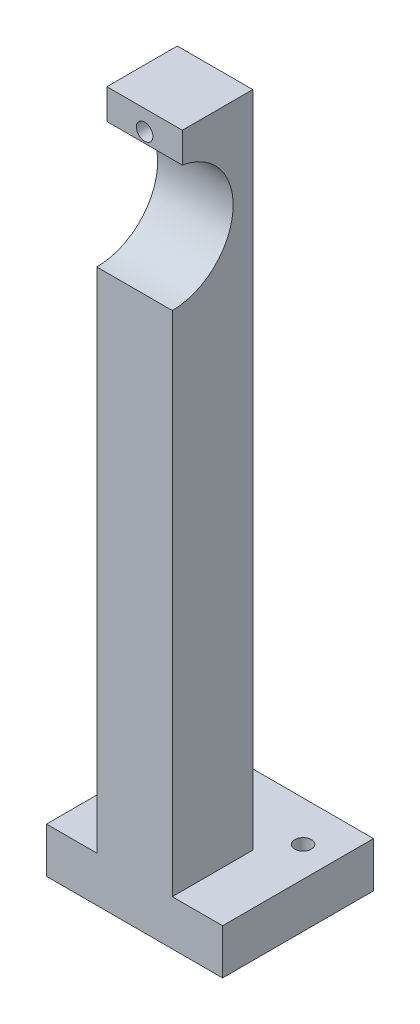
ISO-10303-21;
HEADER;
FILE_DESCRIPTION(('STEP AP214'),'2;1');
FILE_NAME('part.step','',(''),(''),'','','');
FILE_SCHEMA(('AUTOMOTIVE_DESIGN { 1 0 10303 214 1 1 1 1 }'));
ENDSEC;
DATA;
#1=APPLICATION_CONTEXT('core data for automotive mechanical design processes');
#2=APPLICATION_PROTOCOL_DEFINITION('international standard','automotive_design',2000,#1);
#3=PRODUCT_CONTEXT('',#1,'mechanical');
#4=PRODUCT('Part','Part','',(#3));
#5=PRODUCT_RELATED_PRODUCT_CATEGORY('part','',(#4));
#6=PRODUCT_DEFINITION_FORMATION('','',#4);
#7=PRODUCT_DEFINITION_CONTEXT('part definition',#1,'design');
#8=PRODUCT_DEFINITION('design','',#6,#7);
#9=PRODUCT_DEFINITION_SHAPE('','',#8);
#10=(LENGTH_UNIT() NAMED_UNIT(*) SI_UNIT(.MILLI.,.METRE.));
#11=(NAMED_UNIT(*) PLANE_ANGLE_UNIT() SI_UNIT($,.RADIAN.));
#12=(NAMED_UNIT(*) SI_UNIT($,.STERADIAN.) SOLID_ANGLE_UNIT());
#13=UNCERTAINTY_MEASURE_WITH_UNIT(LENGTH_MEASURE(1.E-05),#10,'distance_accuracy_value','');
#14=(GEOMETRIC_REPRESENTATION_CONTEXT(3) GLOBAL_UNCERTAINTY_ASSIGNED_CONTEXT((#13)) GLOBAL_UNIT_ASSIGNED_CONTEXT((#10,
#11,#12)) REPRESENTATION_CONTEXT('',''));
#15=CARTESIAN_POINT('',(0.,0.,0.));
#16=DIRECTION('',(0.,0.,1.));
#17=DIRECTION('',(1.,0.,0.));
#18=AXIS2_PLACEMENT_3D('',#15,#16,#17);
#19=CARTESIAN_POINT('',(137.307957149337,0.,0.));
#20=DIRECTION('',(1.,0.,0.));
#21=DIRECTION('',(0.,0.,-1.));
#22=AXIS2_PLACEMENT_3D('',#19,#20,#21);
#23=PLANE('',#22);
#24=DIRECTION('',(0.,0.,-1.));
#25=VECTOR('',#24,1.);
#26=CARTESIAN_POINT('',(137.307957149337,14.,0.));
#27=LINE('',#26,#25);
#28=CARTESIAN_POINT('',(137.307957149337,14.,-21.990466694079));
#29=VERTEX_POINT('',#28);
#30=CARTESIAN_POINT('',(137.307957149337,14.,-37.990466694079));
#31=VERTEX_POINT('',#30);
#32=EDGE_CURVE('E12',#29,#31,#27,.T.);
#33=ORIENTED_EDGE('',*,*,#32,.F.);
#34=DIRECTION('',(0.,-1.,0.));
#35=VECTOR('',#34,1.);
#36=CARTESIAN_POINT('',(137.307957149337,144.933566105737,-21.9904666940789));
#37=LINE('',#36,#35);
#38=CARTESIAN_POINT('',(137.307957149337,114.9,-21.990466694079));
#39=VERTEX_POINT('',#38);
#40=EDGE_CURVE('E259',#39,#29,#37,.T.);
#41=ORIENTED_EDGE('',*,*,#40,.F.);
#42=CARTESIAN_POINT('',(137.307957149337,127.,-21.9904666940789));
#43=DIRECTION('',(1.,0.,0.));
#44=DIRECTION('',(0.,0.,-1.));
#45=AXIS2_PLACEMENT_3D('',#42,#43,#44);
#46=CIRCLE('',#45,12.1);
#47=CARTESIAN_POINT('',(137.307957149337,138.933566105737,-23.990466694079));
#48=VERTEX_POINT('',#47);
#49=EDGE_CURVE('E82',#39,#48,#46,.T.);
#50=ORIENTED_EDGE('',*,*,#49,.T.);
#51=DIRECTION('',(0.,1.,0.));
#52=VECTOR('',#51,1.);
#53=CARTESIAN_POINT('',(137.307957149337,0.,-23.990466694079));
#54=LINE('',#53,#52);
#55=CARTESIAN_POINT('',(137.307957149337,144.933566105737,-23.990466694079));
#56=VERTEX_POINT('',#55);
#57=EDGE_CURVE('E192',#48,#56,#54,.T.);
#58=ORIENTED_EDGE('',*,*,#57,.T.);
#59=DIRECTION('',(0.,0.,-1.));
#60=VECTOR('',#59,1.);
#61=CARTESIAN_POINT('',(137.307957149337,144.933566105737,0.));
#62=LINE('',#61,#60);
#63=CARTESIAN_POINT('',(137.307957149337,144.933566105737,-37.990466694079));
#64=VERTEX_POINT('',#63);
#65=EDGE_CURVE('E189',#56,#64,#62,.T.);
#66=ORIENTED_EDGE('',*,*,#65,.T.);
#67=DIRECTION('',(0.,-1.,0.));
#68=VECTOR('',#67,1.);
#69=CARTESIAN_POINT('',(137.307957149337,0.,-37.990466694079));
#70=LINE('',#69,#68);
#71=EDGE_CURVE('E186',#64,#31,#70,.T.);
#72=ORIENTED_EDGE('',*,*,#71,.T.);
#73=EDGE_LOOP('',(#33,#41,#50,#58,#66,#72));
#74=FACE_BOUND('',#73,.T.);
#75=ADVANCED_FACE('F56',(#74),#23,.F.);
#76=CARTESIAN_POINT('',(152.307957149337,0.,0.));
#77=DIRECTION('',(1.,0.,0.));
#78=DIRECTION('',(0.,0.,-1.));
#79=AXIS2_PLACEMENT_3D('',#76,#77,#78);
#80=PLANE('',#79);
#81=DIRECTION('',(0.,1.,0.));
#82=VECTOR('',#81,1.);
#83=CARTESIAN_POINT('',(152.307957149337,13.9999999999999,-21.990466694079));
#84=LINE('',#83,#82);
#85=CARTESIAN_POINT('',(152.307957149337,14.,-21.990466694079));
#86=VERTEX_POINT('',#85);
#87=CARTESIAN_POINT('',(152.307957149337,114.9,-21.990466694079));
#88=VERTEX_POINT('',#87);
#89=EDGE_CURVE('E237',#86,#88,#84,.T.);
#90=ORIENTED_EDGE('',*,*,#89,.F.);
#91=DIRECTION('',(0.,0.,-1.));
#92=VECTOR('',#91,1.);
#93=CARTESIAN_POINT('',(152.307957149337,14.,0.));
#94=LINE('',#93,#92);
#95=CARTESIAN_POINT('',(152.307957149337,14.,-37.990466694079));
#96=VERTEX_POINT('',#95);
#97=EDGE_CURVE('E66',#86,#96,#94,.T.);
#98=ORIENTED_EDGE('',*,*,#97,.T.);
#99=DIRECTION('',(0.,-1.,0.));
#100=VECTOR('',#99,1.);
#101=CARTESIAN_POINT('',(152.307957149337,0.,-37.990466694079));
#102=LINE('',#101,#100);
#103=CARTESIAN_POINT('',(152.307957149337,144.933566105737,-37.990466694079));
#104=VERTEX_POINT('',#103);
#105=EDGE_CURVE('E185',#104,#96,#102,.T.);
#106=ORIENTED_EDGE('',*,*,#105,.F.);
#107=DIRECTION('',(0.,0.,-1.));
#108=VECTOR('',#107,1.);
#109=CARTESIAN_POINT('',(152.307957149337,144.933566105737,0.));
#110=LINE('',#109,#108);
#111=CARTESIAN_POINT('',(152.307957149337,144.933566105737,-23.990466694079));
#112=VERTEX_POINT('',#111);
#113=EDGE_CURVE('E201',#112,#104,#110,.T.);
#114=ORIENTED_EDGE('',*,*,#113,.F.);
#115=DIRECTION('',(0.,1.,0.));
#116=VECTOR('',#115,1.);
#117=CARTESIAN_POINT('',(152.307957149337,0.,-23.990466694079));
#118=LINE('',#117,#116);
#119=CARTESIAN_POINT('',(152.307957149337,138.933566105737,-23.990466694079));
#120=VERTEX_POINT('',#119);
#121=EDGE_CURVE('E204',#120,#112,#118,.T.);
#122=ORIENTED_EDGE('',*,*,#121,.F.);
#123=CARTESIAN_POINT('',(152.307957149337,127.,-21.9904666940789));
#124=DIRECTION('',(1.,0.,0.));
#125=DIRECTION('',(0.,0.,-1.));
#126=AXIS2_PLACEMENT_3D('',#123,#124,#125);
#127=CIRCLE('',#126,12.1);
#128=EDGE_CURVE('E100',#88,#120,#127,.T.);
#129=ORIENTED_EDGE('',*,*,#128,.F.);
#130=EDGE_LOOP('',(#90,#98,#106,#114,#122,#129));
#131=FACE_BOUND('',#130,.T.);
#132=ADVANCED_FACE('F235',(#131),#80,.T.);
#133=CARTESIAN_POINT('',(137.307957149337,127.,-21.9904666940789));
#134=DIRECTION('',(1.,0.,0.));
#135=DIRECTION('',(0.,0.,-1.));
#136=AXIS2_PLACEMENT_3D('',#133,#134,#135);
#137=CYLINDRICAL_SURFACE('',#136,12.1);
#138=ORIENTED_EDGE('',*,*,#49,.F.);
#139=DIRECTION('',(1.,0.,0.));
#140=VECTOR('',#139,1.);
#141=CARTESIAN_POINT('',(137.307957149337,114.9,-21.990466694079));
#142=LINE('',#141,#140);
#143=EDGE_CURVE('E162',#39,#88,#142,.T.);
#144=ORIENTED_EDGE('',*,*,#143,.T.);
#145=ORIENTED_EDGE('',*,*,#128,.T.);
#146=DIRECTION('',(1.,0.,0.));
#147=VECTOR('',#146,1.);
#148=CARTESIAN_POINT('',(137.307957149337,138.933566105737,-23.990466694079));
#149=LINE('',#148,#147);
#150=EDGE_CURVE('E209',#48,#120,#149,.T.);
#151=ORIENTED_EDGE('',*,*,#150,.F.);
#152=EDGE_LOOP('',(#138,#144,#145,#151));
#153=FACE_BOUND('',#152,.T.);
#154=ADVANCED_FACE('F251',(#153),#137,.F.);
#155=CARTESIAN_POINT('',(137.307957149337,0.,-23.990466694079));
#156=DIRECTION('',(0.,0.,-1.));
#157=DIRECTION('',(0.,1.,0.));
#158=AXIS2_PLACEMENT_3D('',#155,#156,#157);
#159=PLANE('',#158);
#160=CARTESIAN_POINT('',(144.807957149337,140.933566105737,-23.990466694079));
#161=DIRECTION('',(0.,0.,-1.));
#162=DIRECTION('',(0.,1.,0.));
#163=AXIS2_PLACEMENT_3D('',#160,#161,#162);
#164=CIRCLE('',#163,1.64999999999998);
#165=CARTESIAN_POINT('',(144.807957149337,142.583566105737,-23.990466694079));
#166=VERTEX_POINT('',#165);
#167=EDGE_CURVE('E180',#166,#166,#164,.T.);
#168=ORIENTED_EDGE('',*,*,#167,.T.);
#169=EDGE_LOOP('',(#168));
#170=FACE_BOUND('',#169,.T.);
#171=ORIENTED_EDGE('',*,*,#121,.T.);
#172=DIRECTION('',(1.,0.,0.));
#173=VECTOR('',#172,1.);
#174=CARTESIAN_POINT('',(137.307957149337,144.933566105737,-23.990466694079));
#175=LINE('',#174,#173);
#176=EDGE_CURVE('E212',#56,#112,#175,.T.);
#177=ORIENTED_EDGE('',*,*,#176,.F.);
#178=ORIENTED_EDGE('',*,*,#57,.F.);
#179=ORIENTED_EDGE('',*,*,#150,.T.);
#180=EDGE_LOOP('',(#171,#177,#178,#179));
#181=FACE_BOUND('',#180,.T.);
#182=ADVANCED_FACE('F249',(#170,#181),#159,.F.);
#183=CARTESIAN_POINT('',(137.307957149337,144.933566105737,0.));
#184=DIRECTION('',(0.,-1.,0.));
#185=DIRECTION('',(0.,0.,-1.));
#186=AXIS2_PLACEMENT_3D('',#183,#184,#185);
#187=PLANE('',#186);
#188=ORIENTED_EDGE('',*,*,#113,.T.);
#189=DIRECTION('',(1.,0.,0.));
#190=VECTOR('',#189,1.);
#191=CARTESIAN_POINT('',(137.307957149337,144.933566105737,-37.990466694079));
#192=LINE('',#191,#190);
#193=EDGE_CURVE('E216',#64,#104,#192,.T.);
#194=ORIENTED_EDGE('',*,*,#193,.F.);
#195=ORIENTED_EDGE('',*,*,#65,.F.);
#196=ORIENTED_EDGE('',*,*,#176,.T.);
#197=EDGE_LOOP('',(#188,#194,#195,#196));
#198=FACE_BOUND('',#197,.T.);
#199=ADVANCED_FACE('F245',(#198),#187,.F.);
#200=CARTESIAN_POINT('',(137.307957149337,0.,-37.990466694079));
#201=DIRECTION('',(0.,0.,1.));
#202=DIRECTION('',(0.,-1.,0.));
#203=AXIS2_PLACEMENT_3D('',#200,#201,#202);
#204=PLANE('',#203);
#205=CARTESIAN_POINT('',(144.807957149337,140.933566105737,-37.990466694079));
#206=DIRECTION('',(0.,0.,1.));
#207=DIRECTION('',(0.,-1.,0.));
#208=AXIS2_PLACEMENT_3D('',#205,#206,#207);
#209=CIRCLE('',#208,1.64999999999998);
#210=CARTESIAN_POINT('',(144.807957149337,139.283566105737,-37.990466694079));
#211=VERTEX_POINT('',#210);
#212=EDGE_CURVE('E181',#211,#211,#209,.T.);
#213=ORIENTED_EDGE('',*,*,#212,.T.);
#214=EDGE_LOOP('',(#213));
#215=FACE_BOUND('',#214,.T.);
#216=ORIENTED_EDGE('',*,*,#105,.T.);
#217=DIRECTION('',(1.,0.,0.));
#218=VECTOR('',#217,1.);
#219=CARTESIAN_POINT('',(137.307957149337,14.,-37.990466694079));
#220=LINE('',#219,#218);
#221=EDGE_CURVE('E220',#31,#96,#220,.T.);
#222=ORIENTED_EDGE('',*,*,#221,.F.);
#223=ORIENTED_EDGE('',*,*,#71,.F.);
#224=ORIENTED_EDGE('',*,*,#193,.T.);
#225=EDGE_LOOP('',(#216,#222,#223,#224));
#226=FACE_BOUND('',#225,.T.);
#227=ADVANCED_FACE('F240',(#215,#226),#204,.F.);
#228=CARTESIAN_POINT('',(137.307957149337,14.,0.));
#229=DIRECTION('',(0.,1.,0.));
#230=DIRECTION('',(0.,0.,1.));
#231=AXIS2_PLACEMENT_3D('',#228,#229,#230);
#232=PLANE('',#231);
#233=DIRECTION('',(-1.,0.,0.));
#234=VECTOR('',#233,1.);
#235=CARTESIAN_POINT('',(162.307957149337,14.,-21.990466694079));
#236=LINE('',#235,#234);
#237=CARTESIAN_POINT('',(162.307957149337,14.,-21.990466694079));
#238=VERTEX_POINT('',#237);
#239=EDGE_CURVE('E146',#238,#86,#236,.T.);
#240=ORIENTED_EDGE('',*,*,#239,.F.);
#241=DIRECTION('',(0.,0.,1.));
#242=VECTOR('',#241,1.);
#243=CARTESIAN_POINT('',(162.307957149337,14.,-5.99046669407898));
#244=LINE('',#243,#242);
#245=CARTESIAN_POINT('',(162.307957149337,14.,-51.990466694079));
#246=VERTEX_POINT('',#245);
#247=EDGE_CURVE('E159',#246,#238,#244,.T.);
#248=ORIENTED_EDGE('',*,*,#247,.F.);
#249=DIRECTION('',(1.,0.,0.));
#250=VECTOR('',#249,1.);
#251=CARTESIAN_POINT('',(137.307957149337,14.,-51.990466694079));
#252=LINE('',#251,#250);
#253=CARTESIAN_POINT('',(127.307957149337,14.,-51.990466694079));
#254=VERTEX_POINT('',#253);
#255=EDGE_CURVE('E223',#254,#246,#252,.T.);
#256=ORIENTED_EDGE('',*,*,#255,.F.);
#257=DIRECTION('',(0.,0.,-1.));
#258=VECTOR('',#257,1.);
#259=CARTESIAN_POINT('',(127.307957149337,14.,8.00953330592103));
#260=LINE('',#259,#258);
#261=CARTESIAN_POINT('',(127.307957149337,14.,-21.990466694079));
#262=VERTEX_POINT('',#261);
#263=EDGE_CURVE('E169',#262,#254,#260,.T.);
#264=ORIENTED_EDGE('',*,*,#263,.F.);
#265=DIRECTION('',(-1.,0.,0.));
#266=VECTOR('',#265,1.);
#267=CARTESIAN_POINT('',(137.307957149337,14.,-21.990466694079));
#268=LINE('',#267,#266);
#269=EDGE_CURVE('E286',#29,#262,#268,.T.);
#270=ORIENTED_EDGE('',*,*,#269,.F.);
#271=ORIENTED_EDGE('',*,*,#32,.T.);
#272=ORIENTED_EDGE('',*,*,#221,.T.);
#273=ORIENTED_EDGE('',*,*,#97,.F.);
#274=EDGE_LOOP('',(#240,#248,#256,#264,#270,#271,#272,#273));
#275=FACE_BOUND('',#274,.T.);
#276=CARTESIAN_POINT('',(133.307957149337,14.,-43.990466694079));
#277=DIRECTION('',(0.,1.,0.));
#278=DIRECTION('',(0.,0.,1.));
#279=AXIS2_PLACEMENT_3D('',#276,#277,#278);
#280=CIRCLE('',#279,1.64999999999998);
#281=CARTESIAN_POINT('',(133.307957149337,14.,-42.340466694079));
#282=VERTEX_POINT('',#281);
#283=EDGE_CURVE('E264',#282,#282,#280,.T.);
#284=ORIENTED_EDGE('',*,*,#283,.F.);
#285=EDGE_LOOP('',(#284));
#286=FACE_BOUND('',#285,.T.);
#287=CARTESIAN_POINT('',(156.307957149337,14.,-43.990466694079));
#288=DIRECTION('',(0.,1.,0.));
#289=DIRECTION('',(0.,0.,1.));
#290=AXIS2_PLACEMENT_3D('',#287,#288,#289);
#291=CIRCLE('',#290,1.64999999999998);
#292=CARTESIAN_POINT('',(156.307957149337,14.,-42.340466694079));
#293=VERTEX_POINT('',#292);
#294=EDGE_CURVE('E268',#293,#293,#291,.T.);
#295=ORIENTED_EDGE('',*,*,#294,.F.);
#296=EDGE_LOOP('',(#295));
#297=FACE_BOUND('',#296,.T.);
#298=ADVANCED_FACE('F156',(#275,#286,#297),#232,.T.);
#299=CARTESIAN_POINT('',(137.307957149337,0.,-51.990466694079));
#300=DIRECTION('',(0.,0.,-1.));
#301=DIRECTION('',(-1.,0.,0.));
#302=AXIS2_PLACEMENT_3D('',#299,#300,#301);
#303=PLANE('',#302);
#304=ORIENTED_EDGE('',*,*,#255,.T.);
#305=DIRECTION('',(0.,1.,0.));
#306=VECTOR('',#305,1.);
#307=CARTESIAN_POINT('',(162.307957149337,5.,-51.990466694079));
#308=LINE('',#307,#306);
#309=CARTESIAN_POINT('',(162.307957149337,5.,-51.990466694079));
#310=VERTEX_POINT('',#309);
#311=EDGE_CURVE('E166',#310,#246,#308,.T.);
#312=ORIENTED_EDGE('',*,*,#311,.F.);
#313=DIRECTION('',(1.,0.,0.));
#314=VECTOR('',#313,1.);
#315=CARTESIAN_POINT('',(137.307957149337,5.,-51.990466694079));
#316=LINE('',#315,#314);
#317=CARTESIAN_POINT('',(127.307957149337,5.,-51.990466694079));
#318=VERTEX_POINT('',#317);
#319=EDGE_CURVE('E197',#318,#310,#316,.T.);
#320=ORIENTED_EDGE('',*,*,#319,.F.);
#321=DIRECTION('',(0.,-1.,0.));
#322=VECTOR('',#321,1.);
#323=CARTESIAN_POINT('',(127.307957149337,14.,-51.990466694079));
#324=LINE('',#323,#322);
#325=EDGE_CURVE('E272',#254,#318,#324,.T.);
#326=ORIENTED_EDGE('',*,*,#325,.F.);
#327=EDGE_LOOP('',(#304,#312,#320,#326));
#328=FACE_BOUND('',#327,.T.);
#329=ADVANCED_FACE('F58',(#328),#303,.T.);
#330=CARTESIAN_POINT('',(144.807957149337,140.933566105737,-5.99046669407898));
#331=DIRECTION('',(0.,0.,1.));
#332=DIRECTION('',(1.,0.,0.));
#333=AXIS2_PLACEMENT_3D('',#330,#331,#332);
#334=CYLINDRICAL_SURFACE('',#333,1.64999999999998);
#335=ORIENTED_EDGE('',*,*,#167,.F.);
#336=EDGE_LOOP('',(#335));
#337=FACE_BOUND('',#336,.T.);
#338=ORIENTED_EDGE('',*,*,#212,.F.);
#339=EDGE_LOOP('',(#338));
#340=FACE_BOUND('',#339,.T.);
#341=ADVANCED_FACE('F303',(#337,#340),#334,.F.);
#342=CARTESIAN_POINT('',(162.307957149337,0.,0.));
#343=DIRECTION('',(1.,0.,0.));
#344=DIRECTION('',(0.,0.,-1.));
#345=AXIS2_PLACEMENT_3D('',#342,#343,#344);
#346=PLANE('',#345);
#347=DIRECTION('',(0.,1.,0.));
#348=VECTOR('',#347,1.);
#349=CARTESIAN_POINT('',(162.307957149337,4.99999999999995,-21.990466694079));
#350=LINE('',#349,#348);
#351=CARTESIAN_POINT('',(162.307957149337,5.,-21.990466694079));
#352=VERTEX_POINT('',#351);
#353=EDGE_CURVE('E143',#352,#238,#350,.T.);
#354=ORIENTED_EDGE('',*,*,#353,.F.);
#355=DIRECTION('',(0.,0.,-1.));
#356=VECTOR('',#355,1.);
#357=CARTESIAN_POINT('',(162.307957149337,5.,8.00953330592102));
#358=LINE('',#357,#356);
#359=EDGE_CURVE('E168',#352,#310,#358,.T.);
#360=ORIENTED_EDGE('',*,*,#359,.T.);
#361=ORIENTED_EDGE('',*,*,#311,.T.);
#362=ORIENTED_EDGE('',*,*,#247,.T.);
#363=EDGE_LOOP('',(#354,#360,#361,#362));
#364=FACE_BOUND('',#363,.T.);
#365=ADVANCED_FACE('F164',(#364),#346,.T.);
#366=CARTESIAN_POINT('',(127.307957149337,0.,0.));
#367=DIRECTION('',(-1.,0.,0.));
#368=DIRECTION('',(0.,0.,1.));
#369=AXIS2_PLACEMENT_3D('',#366,#367,#368);
#370=PLANE('',#369);
#371=DIRECTION('',(0.,-1.,0.));
#372=VECTOR('',#371,1.);
#373=CARTESIAN_POINT('',(127.307957149337,13.9999999999999,-21.990466694079));
#374=LINE('',#373,#372);
#375=CARTESIAN_POINT('',(127.307957149337,5.,-21.990466694079));
#376=VERTEX_POINT('',#375);
#377=EDGE_CURVE('E73',#262,#376,#374,.T.);
#378=ORIENTED_EDGE('',*,*,#377,.F.);
#379=ORIENTED_EDGE('',*,*,#263,.T.);
#380=ORIENTED_EDGE('',*,*,#325,.T.);
#381=DIRECTION('',(0.,0.,1.));
#382=VECTOR('',#381,1.);
#383=CARTESIAN_POINT('',(127.307957149337,5.,-51.990466694079));
#384=LINE('',#383,#382);
#385=EDGE_CURVE('E174',#318,#376,#384,.T.);
#386=ORIENTED_EDGE('',*,*,#385,.T.);
#387=EDGE_LOOP('',(#378,#379,#380,#386));
#388=FACE_BOUND('',#387,.T.);
#389=ADVANCED_FACE('F278',(#388),#370,.T.);
#390=CARTESIAN_POINT('',(156.307957149337,14.,-43.990466694079));
#391=DIRECTION('',(0.,1.,0.));
#392=DIRECTION('',(0.,0.,1.));
#393=AXIS2_PLACEMENT_3D('',#390,#391,#392);
#394=CYLINDRICAL_SURFACE('',#393,1.64999999999998);
#395=CARTESIAN_POINT('',(156.307957149337,5.,-43.990466694079));
#396=DIRECTION('',(0.,1.,0.));
#397=DIRECTION('',(0.,0.,1.));
#398=AXIS2_PLACEMENT_3D('',#395,#396,#397);
#399=CIRCLE('',#398,1.64999999999998);
#400=CARTESIAN_POINT('',(156.307957149337,5.,-42.340466694079));
#401=VERTEX_POINT('',#400);
#402=EDGE_CURVE('E256',#401,#401,#399,.F.);
#403=ORIENTED_EDGE('',*,*,#402,.T.);
#404=EDGE_LOOP('',(#403));
#405=FACE_BOUND('',#404,.T.);
#406=ORIENTED_EDGE('',*,*,#294,.T.);
#407=EDGE_LOOP('',(#406));
#408=FACE_BOUND('',#407,.T.);
#409=ADVANCED_FACE('F334',(#405,#408),#394,.F.);
#410=CARTESIAN_POINT('',(133.307957149337,14.,-43.990466694079));
#411=DIRECTION('',(0.,1.,0.));
#412=DIRECTION('',(0.,0.,1.));
#413=AXIS2_PLACEMENT_3D('',#410,#411,#412);
#414=CYLINDRICAL_SURFACE('',#413,1.64999999999998);
#415=CARTESIAN_POINT('',(133.307957149337,5.,-43.990466694079));
#416=DIRECTION('',(0.,1.,0.));
#417=DIRECTION('',(0.,0.,1.));
#418=AXIS2_PLACEMENT_3D('',#415,#416,#417);
#419=CIRCLE('',#418,1.64999999999998);
#420=CARTESIAN_POINT('',(133.307957149337,5.,-42.340466694079));
#421=VERTEX_POINT('',#420);
#422=EDGE_CURVE('E60',#421,#421,#419,.F.);
#423=ORIENTED_EDGE('',*,*,#422,.T.);
#424=EDGE_LOOP('',(#423));
#425=FACE_BOUND('',#424,.T.);
#426=ORIENTED_EDGE('',*,*,#283,.T.);
#427=EDGE_LOOP('',(#426));
#428=FACE_BOUND('',#427,.T.);
#429=ADVANCED_FACE('F338',(#425,#428),#414,.F.);
#430=CARTESIAN_POINT('',(313.507957149337,5.,-74.770466694079));
#431=DIRECTION('',(0.,1.,0.));
#432=DIRECTION('',(0.,0.,1.));
#433=AXIS2_PLACEMENT_3D('',#430,#431,#432);
#434=PLANE('',#433);
#435=ORIENTED_EDGE('',*,*,#359,.F.);
#436=DIRECTION('',(1.,0.,0.));
#437=VECTOR('',#436,1.);
#438=CARTESIAN_POINT('',(127.307957149337,5.,-21.990466694079));
#439=LINE('',#438,#437);
#440=EDGE_CURVE('E148',#376,#352,#439,.T.);
#441=ORIENTED_EDGE('',*,*,#440,.F.);
#442=ORIENTED_EDGE('',*,*,#385,.F.);
#443=ORIENTED_EDGE('',*,*,#319,.T.);
#444=EDGE_LOOP('',(#435,#441,#442,#443));
#445=FACE_BOUND('',#444,.T.);
#446=ORIENTED_EDGE('',*,*,#422,.F.);
#447=EDGE_LOOP('',(#446));
#448=FACE_BOUND('',#447,.T.);
#449=ORIENTED_EDGE('',*,*,#402,.F.);
#450=EDGE_LOOP('',(#449));
#451=FACE_BOUND('',#450,.T.);
#452=ADVANCED_FACE('F283',(#445,#448,#451),#434,.F.);
#453=CARTESIAN_POINT('',(0.,0.,-21.990466694079));
#454=DIRECTION('',(0.,0.,-1.));
#455=DIRECTION('',(0.,1.,0.));
#456=AXIS2_PLACEMENT_3D('',#453,#454,#455);
#457=PLANE('',#456);
#458=ORIENTED_EDGE('',*,*,#40,.T.);
#459=ORIENTED_EDGE('',*,*,#269,.T.);
#460=ORIENTED_EDGE('',*,*,#377,.T.);
#461=ORIENTED_EDGE('',*,*,#440,.T.);
#462=ORIENTED_EDGE('',*,*,#353,.T.);
#463=ORIENTED_EDGE('',*,*,#239,.T.);
#464=ORIENTED_EDGE('',*,*,#89,.T.);
#465=ORIENTED_EDGE('',*,*,#143,.F.);
#466=EDGE_LOOP('',(#458,#459,#460,#461,#462,#463,#464,#465));
#467=FACE_BOUND('',#466,.T.);
#468=ADVANCED_FACE('F145',(#467),#457,.F.);
#469=CLOSED_SHELL('',(#75,#132,#154,#182,#199,#227,#298,#329,#341,#365,#389,#409,#429,#452,#468));
#470=MANIFOLD_SOLID_BREP('B2',#469);
#471=ADVANCED_BREP_SHAPE_REPRESENTATION('',(#18,#470),#14);
#472=SHAPE_DEFINITION_REPRESENTATION(#9,#471);
ENDSEC;
END-ISO-10303-21;
